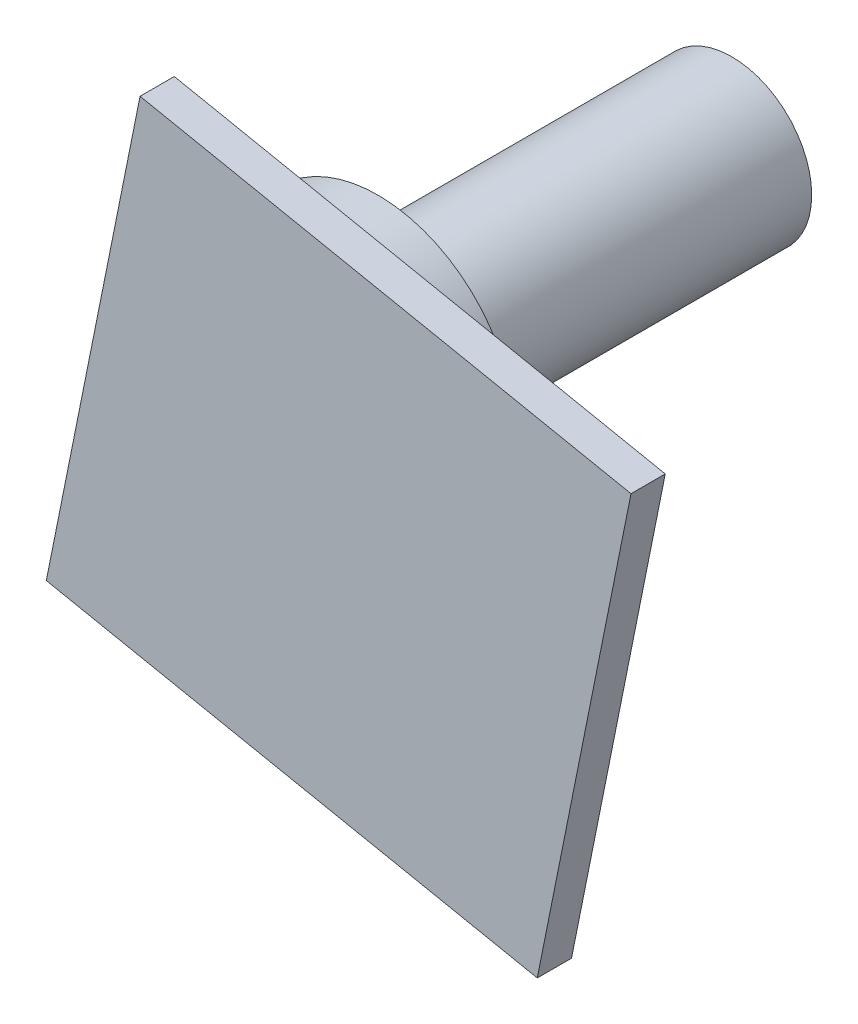
ISO-10303-21;
HEADER;
FILE_DESCRIPTION(('STEP AP214'),'2;1');
FILE_NAME('part.step','',(''),(''),'','','');
FILE_SCHEMA(('AUTOMOTIVE_DESIGN { 1 0 10303 214 1 1 1 1 }'));
ENDSEC;
DATA;
#1=APPLICATION_CONTEXT('core data for automotive mechanical design processes');
#2=APPLICATION_PROTOCOL_DEFINITION('international standard','automotive_design',2000,#1);
#3=PRODUCT_CONTEXT('',#1,'mechanical');
#4=PRODUCT('Part','Part','',(#3));
#5=PRODUCT_RELATED_PRODUCT_CATEGORY('part','',(#4));
#6=PRODUCT_DEFINITION_FORMATION('','',#4);
#7=PRODUCT_DEFINITION_CONTEXT('part definition',#1,'design');
#8=PRODUCT_DEFINITION('design','',#6,#7);
#9=PRODUCT_DEFINITION_SHAPE('','',#8);
#10=(LENGTH_UNIT() NAMED_UNIT(*) SI_UNIT(.MILLI.,.METRE.));
#11=(NAMED_UNIT(*) PLANE_ANGLE_UNIT() SI_UNIT($,.RADIAN.));
#12=(NAMED_UNIT(*) SI_UNIT($,.STERADIAN.) SOLID_ANGLE_UNIT());
#13=UNCERTAINTY_MEASURE_WITH_UNIT(LENGTH_MEASURE(1.E-05),#10,'distance_accuracy_value','');
#14=(GEOMETRIC_REPRESENTATION_CONTEXT(3) GLOBAL_UNCERTAINTY_ASSIGNED_CONTEXT((#13)) GLOBAL_UNIT_ASSIGNED_CONTEXT((#10,
#11,#12)) REPRESENTATION_CONTEXT('',''));
#15=CARTESIAN_POINT('',(0.,0.,0.));
#16=DIRECTION('',(0.,0.,1.));
#17=DIRECTION('',(1.,0.,0.));
#18=AXIS2_PLACEMENT_3D('',#15,#16,#17);
#19=CARTESIAN_POINT('',(-86.6066497970745,-63.7835303855215,34.));
#20=DIRECTION('',(0.,0.,-1.));
#21=DIRECTION('',(-1.,0.,0.));
#22=AXIS2_PLACEMENT_3D('',#19,#20,#21);
#23=CYLINDRICAL_SURFACE('',#22,7.00000000000002);
#24=CARTESIAN_POINT('',(-86.6066497970745,-63.7835303855215,0.));
#25=DIRECTION('',(0.,0.,1.));
#26=DIRECTION('',(1.,0.,0.));
#27=AXIS2_PLACEMENT_3D('',#24,#25,#26);
#28=CIRCLE('',#27,7.00000000000002);
#29=CARTESIAN_POINT('',(-79.6066497970745,-63.7835303855215,0.));
#30=VERTEX_POINT('',#29);
#31=EDGE_CURVE('E49',#30,#30,#28,.T.);
#32=ORIENTED_EDGE('',*,*,#31,.T.);
#33=EDGE_LOOP('',(#32));
#34=FACE_BOUND('',#33,.T.);
#35=CARTESIAN_POINT('',(-86.6066497970745,-63.7835303855215,31.));
#36=DIRECTION('',(0.,0.,1.));
#37=DIRECTION('',(1.,0.,0.));
#38=AXIS2_PLACEMENT_3D('',#35,#36,#37);
#39=CIRCLE('',#38,7.00000000000002);
#40=CARTESIAN_POINT('',(-79.6066497970745,-63.7835303855215,31.));
#41=VERTEX_POINT('',#40);
#42=EDGE_CURVE('E11',#41,#41,#39,.T.);
#43=ORIENTED_EDGE('',*,*,#42,.F.);
#44=EDGE_LOOP('',(#43));
#45=FACE_BOUND('',#44,.T.);
#46=ADVANCED_FACE('F41',(#34,#45),#23,.T.);
#47=CARTESIAN_POINT('',(-86.6066497970745,-63.7835303855215,0.));
#48=DIRECTION('',(0.,0.,1.));
#49=DIRECTION('',(1.,0.,0.));
#50=AXIS2_PLACEMENT_3D('',#47,#48,#49);
#51=PLANE('',#50);
#52=ORIENTED_EDGE('',*,*,#31,.F.);
#53=EDGE_LOOP('',(#52));
#54=FACE_BOUND('',#53,.T.);
#55=ADVANCED_FACE('F127',(#54),#51,.F.);
#56=CARTESIAN_POINT('',(-86.6066497970745,-63.7835303855215,36.));
#57=DIRECTION('',(0.,0.,-1.));
#58=DIRECTION('',(-1.,0.,0.));
#59=AXIS2_PLACEMENT_3D('',#56,#57,#58);
#60=CYLINDRICAL_SURFACE('',#59,12.);
#61=CARTESIAN_POINT('',(-86.6066497970745,-63.7835303855215,36.));
#62=DIRECTION('',(0.,0.,1.));
#63=DIRECTION('',(1.,0.,0.));
#64=AXIS2_PLACEMENT_3D('',#61,#62,#63);
#65=CIRCLE('',#64,12.);
#66=CARTESIAN_POINT('',(-74.6066497970745,-63.7835303855215,36.));
#67=VERTEX_POINT('',#66);
#68=EDGE_CURVE('E120',#67,#67,#65,.T.);
#69=ORIENTED_EDGE('',*,*,#68,.F.);
#70=EDGE_LOOP('',(#69));
#71=FACE_BOUND('',#70,.T.);
#72=CARTESIAN_POINT('',(-86.6066497970745,-63.7835303855215,31.));
#73=DIRECTION('',(0.,0.,1.));
#74=DIRECTION('',(1.,0.,0.));
#75=AXIS2_PLACEMENT_3D('',#72,#73,#74);
#76=CIRCLE('',#75,12.);
#77=CARTESIAN_POINT('',(-74.6066497970745,-63.7835303855215,31.));
#78=VERTEX_POINT('',#77);
#79=EDGE_CURVE('E117',#78,#78,#76,.T.);
#80=ORIENTED_EDGE('',*,*,#79,.T.);
#81=EDGE_LOOP('',(#80));
#82=FACE_BOUND('',#81,.T.);
#83=ADVANCED_FACE('F129',(#71,#82),#60,.T.);
#84=CARTESIAN_POINT('',(-86.6066497970745,-63.7835303855215,31.));
#85=DIRECTION('',(0.,0.,1.));
#86=DIRECTION('',(1.,0.,0.));
#87=AXIS2_PLACEMENT_3D('',#84,#85,#86);
#88=PLANE('',#87);
#89=ORIENTED_EDGE('',*,*,#42,.T.);
#90=EDGE_LOOP('',(#89));
#91=FACE_BOUND('',#90,.T.);
#92=ORIENTED_EDGE('',*,*,#79,.F.);
#93=EDGE_LOOP('',(#92));
#94=FACE_BOUND('',#93,.T.);
#95=ADVANCED_FACE('F134',(#91,#94),#88,.F.);
#96=CARTESIAN_POINT('',(-99.4536099060906,-46.7085878786227,39.));
#97=DIRECTION('',(0.980385757120003,-0.197088221962245,0.));
#98=DIRECTION('',(0.197088221962245,0.980385757120003,0.));
#99=AXIS2_PLACEMENT_3D('',#96,#97,#98);
#100=PLANE('',#99);
#101=DIRECTION('',(-0.197088221962245,-0.980385757120003,0.));
#102=VECTOR('',#101,1.);
#103=CARTESIAN_POINT('',(-99.4536099060906,-46.7085878786227,36.));
#104=LINE('',#103,#102);
#105=CARTESIAN_POINT('',(-99.4536099060906,-46.7085878786227,36.));
#106=VERTEX_POINT('',#105);
#107=CARTESIAN_POINT('',(-107.666591911313,-87.5628332578606,36.));
#108=VERTEX_POINT('',#107);
#109=EDGE_CURVE('E108',#106,#108,#104,.T.);
#110=ORIENTED_EDGE('',*,*,#109,.T.);
#111=DIRECTION('',(0.,0.,-1.));
#112=VECTOR('',#111,1.);
#113=CARTESIAN_POINT('',(-107.666591911313,-87.5628332578606,39.));
#114=LINE('',#113,#112);
#115=CARTESIAN_POINT('',(-107.666591911313,-87.5628332578606,39.));
#116=VERTEX_POINT('',#115);
#117=EDGE_CURVE('E99',#116,#108,#114,.T.);
#118=ORIENTED_EDGE('',*,*,#117,.F.);
#119=DIRECTION('',(-0.197088221962245,-0.980385757120003,0.));
#120=VECTOR('',#119,1.);
#121=CARTESIAN_POINT('',(-99.4536099060906,-46.7085878786227,39.));
#122=LINE('',#121,#120);
#123=CARTESIAN_POINT('',(-99.4536099060906,-46.7085878786227,39.));
#124=VERTEX_POINT('',#123);
#125=EDGE_CURVE('E93',#124,#116,#122,.T.);
#126=ORIENTED_EDGE('',*,*,#125,.F.);
#127=DIRECTION('',(0.,0.,-1.));
#128=VECTOR('',#127,1.);
#129=CARTESIAN_POINT('',(-99.4536099060906,-46.7085878786227,39.));
#130=LINE('',#129,#128);
#131=EDGE_CURVE('E104',#124,#106,#130,.T.);
#132=ORIENTED_EDGE('',*,*,#131,.T.);
#133=EDGE_LOOP('',(#110,#118,#126,#132));
#134=FACE_BOUND('',#133,.T.);
#135=ADVANCED_FACE('F140',(#134),#100,.F.);
#136=CARTESIAN_POINT('',(-107.666591911313,-87.5628332578606,39.));
#137=DIRECTION('',(0.197088221962244,0.980385757120003,0.));
#138=DIRECTION('',(-0.980385757120003,0.197088221962244,0.));
#139=AXIS2_PLACEMENT_3D('',#136,#137,#138);
#140=PLANE('',#139);
#141=DIRECTION('',(0.980385757120003,-0.197088221962244,0.));
#142=VECTOR('',#141,1.);
#143=CARTESIAN_POINT('',(-107.666591911313,-87.5628332578606,36.));
#144=LINE('',#143,#142);
#145=CARTESIAN_POINT('',(-64.6498428856889,-96.2105461795189,36.));
#146=VERTEX_POINT('',#145);
#147=EDGE_CURVE('E98',#108,#146,#144,.T.);
#148=ORIENTED_EDGE('',*,*,#147,.T.);
#149=DIRECTION('',(0.,0.,-1.));
#150=VECTOR('',#149,1.);
#151=CARTESIAN_POINT('',(-64.6498428856889,-96.2105461795189,39.));
#152=LINE('',#151,#150);
#153=CARTESIAN_POINT('',(-64.6498428856889,-96.2105461795189,39.));
#154=VERTEX_POINT('',#153);
#155=EDGE_CURVE('E96',#154,#146,#152,.T.);
#156=ORIENTED_EDGE('',*,*,#155,.F.);
#157=DIRECTION('',(0.980385757120003,-0.197088221962244,0.));
#158=VECTOR('',#157,1.);
#159=CARTESIAN_POINT('',(-107.666591911313,-87.5628332578606,39.));
#160=LINE('',#159,#158);
#161=EDGE_CURVE('E88',#116,#154,#160,.T.);
#162=ORIENTED_EDGE('',*,*,#161,.F.);
#163=ORIENTED_EDGE('',*,*,#117,.T.);
#164=EDGE_LOOP('',(#148,#156,#162,#163));
#165=FACE_BOUND('',#164,.T.);
#166=ADVANCED_FACE('F97',(#165),#140,.F.);
#167=CARTESIAN_POINT('',(-56.4368608804662,-55.356300800281,39.));
#168=DIRECTION('',(-0.980385757120003,0.197088221962245,0.));
#169=DIRECTION('',(-0.197088221962245,-0.980385757120003,0.));
#170=AXIS2_PLACEMENT_3D('',#167,#168,#169);
#171=PLANE('',#170);
#172=DIRECTION('',(0.197088221962245,0.980385757120003,0.));
#173=VECTOR('',#172,1.);
#174=CARTESIAN_POINT('',(-56.4368608804662,-55.356300800281,36.));
#175=LINE('',#174,#173);
#176=CARTESIAN_POINT('',(-56.4368608804662,-55.356300800281,36.));
#177=VERTEX_POINT('',#176);
#178=EDGE_CURVE('E74',#146,#177,#175,.T.);
#179=ORIENTED_EDGE('',*,*,#178,.T.);
#180=DIRECTION('',(0.,0.,-1.));
#181=VECTOR('',#180,1.);
#182=CARTESIAN_POINT('',(-56.4368608804662,-55.356300800281,39.));
#183=LINE('',#182,#181);
#184=CARTESIAN_POINT('',(-56.4368608804662,-55.356300800281,39.));
#185=VERTEX_POINT('',#184);
#186=EDGE_CURVE('E100',#185,#177,#183,.T.);
#187=ORIENTED_EDGE('',*,*,#186,.F.);
#188=DIRECTION('',(0.197088221962245,0.980385757120003,0.));
#189=VECTOR('',#188,1.);
#190=CARTESIAN_POINT('',(-56.4368608804662,-55.356300800281,39.));
#191=LINE('',#190,#189);
#192=EDGE_CURVE('E91',#154,#185,#191,.T.);
#193=ORIENTED_EDGE('',*,*,#192,.F.);
#194=ORIENTED_EDGE('',*,*,#155,.T.);
#195=EDGE_LOOP('',(#179,#187,#193,#194));
#196=FACE_BOUND('',#195,.T.);
#197=ADVANCED_FACE('F102',(#196),#171,.F.);
#198=CARTESIAN_POINT('',(-99.4536099060906,-46.7085878786227,39.));
#199=DIRECTION('',(-0.197088221962244,-0.980385757120003,0.));
#200=DIRECTION('',(0.980385757120003,-0.197088221962244,0.));
#201=AXIS2_PLACEMENT_3D('',#198,#199,#200);
#202=PLANE('',#201);
#203=DIRECTION('',(-0.980385757120003,0.197088221962244,0.));
#204=VECTOR('',#203,1.);
#205=CARTESIAN_POINT('',(-99.4536099060906,-46.7085878786227,36.));
#206=LINE('',#205,#204);
#207=EDGE_CURVE('E80',#177,#106,#206,.T.);
#208=ORIENTED_EDGE('',*,*,#207,.T.);
#209=ORIENTED_EDGE('',*,*,#131,.F.);
#210=DIRECTION('',(-0.980385757120003,0.197088221962244,0.));
#211=VECTOR('',#210,1.);
#212=CARTESIAN_POINT('',(-99.4536099060906,-46.7085878786227,39.));
#213=LINE('',#212,#211);
#214=EDGE_CURVE('E57',#185,#124,#213,.T.);
#215=ORIENTED_EDGE('',*,*,#214,.F.);
#216=ORIENTED_EDGE('',*,*,#186,.T.);
#217=EDGE_LOOP('',(#208,#209,#215,#216));
#218=FACE_BOUND('',#217,.T.);
#219=ADVANCED_FACE('F149',(#218),#202,.F.);
#220=CARTESIAN_POINT('',(0.,0.,39.));
#221=DIRECTION('',(0.,0.,1.));
#222=DIRECTION('',(1.,0.,0.));
#223=AXIS2_PLACEMENT_3D('',#220,#221,#222);
#224=PLANE('',#223);
#225=ORIENTED_EDGE('',*,*,#125,.T.);
#226=ORIENTED_EDGE('',*,*,#161,.T.);
#227=ORIENTED_EDGE('',*,*,#192,.T.);
#228=ORIENTED_EDGE('',*,*,#214,.T.);
#229=EDGE_LOOP('',(#225,#226,#227,#228));
#230=FACE_BOUND('',#229,.T.);
#231=ADVANCED_FACE('F89',(#230),#224,.T.);
#232=CARTESIAN_POINT('',(0.,0.,36.));
#233=DIRECTION('',(0.,0.,1.));
#234=DIRECTION('',(1.,0.,0.));
#235=AXIS2_PLACEMENT_3D('',#232,#233,#234);
#236=PLANE('',#235);
#237=ORIENTED_EDGE('',*,*,#68,.T.);
#238=EDGE_LOOP('',(#237));
#239=FACE_BOUND('',#238,.T.);
#240=ORIENTED_EDGE('',*,*,#109,.F.);
#241=ORIENTED_EDGE('',*,*,#207,.F.);
#242=ORIENTED_EDGE('',*,*,#178,.F.);
#243=ORIENTED_EDGE('',*,*,#147,.F.);
#244=EDGE_LOOP('',(#240,#241,#242,#243));
#245=FACE_BOUND('',#244,.T.);
#246=ADVANCED_FACE('F152',(#239,#245),#236,.F.);
#247=CLOSED_SHELL('',(#46,#55,#83,#95,#135,#166,#197,#219,#231,#246));
#248=MANIFOLD_SOLID_BREP('B2',#247);
#249=ADVANCED_BREP_SHAPE_REPRESENTATION('',(#18,#248),#14);
#250=SHAPE_DEFINITION_REPRESENTATION(#9,#249);
ENDSEC;
END-ISO-10303-21;
